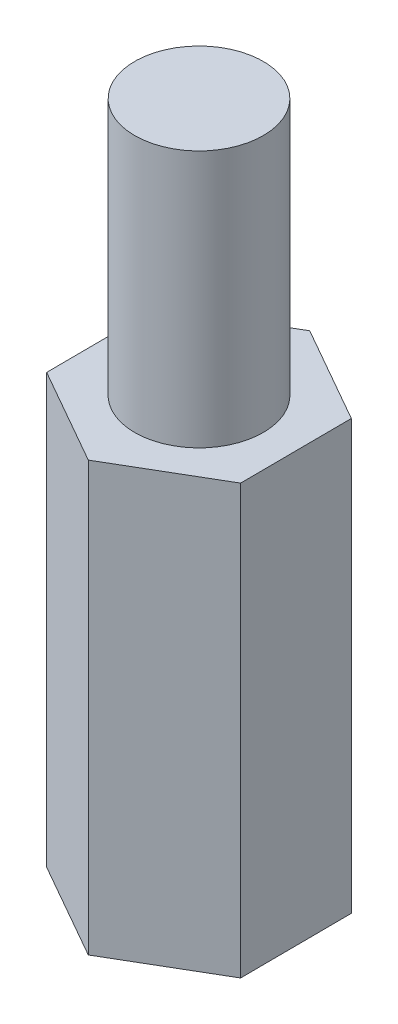
ISO-10303-21;
HEADER;
FILE_DESCRIPTION(('STEP AP214'),'2;1');
FILE_NAME('part.step','',(''),(''),'','','');
FILE_SCHEMA(('AUTOMOTIVE_DESIGN { 1 0 10303 214 1 1 1 1 }'));
ENDSEC;
DATA;
#1=APPLICATION_CONTEXT('core data for automotive mechanical design processes');
#2=APPLICATION_PROTOCOL_DEFINITION('international standard','automotive_design',2000,#1);
#3=PRODUCT_CONTEXT('',#1,'mechanical');
#4=PRODUCT('Part','Part','',(#3));
#5=PRODUCT_RELATED_PRODUCT_CATEGORY('part','',(#4));
#6=PRODUCT_DEFINITION_FORMATION('','',#4);
#7=PRODUCT_DEFINITION_CONTEXT('part definition',#1,'design');
#8=PRODUCT_DEFINITION('design','',#6,#7);
#9=PRODUCT_DEFINITION_SHAPE('','',#8);
#10=(LENGTH_UNIT() NAMED_UNIT(*) SI_UNIT(.MILLI.,.METRE.));
#11=(NAMED_UNIT(*) PLANE_ANGLE_UNIT() SI_UNIT($,.RADIAN.));
#12=(NAMED_UNIT(*) SI_UNIT($,.STERADIAN.) SOLID_ANGLE_UNIT());
#13=UNCERTAINTY_MEASURE_WITH_UNIT(LENGTH_MEASURE(1.E-05),#10,'distance_accuracy_value','');
#14=(GEOMETRIC_REPRESENTATION_CONTEXT(3) GLOBAL_UNCERTAINTY_ASSIGNED_CONTEXT((#13)) GLOBAL_UNIT_ASSIGNED_CONTEXT((#10,
#11,#12)) REPRESENTATION_CONTEXT('',''));
#15=CARTESIAN_POINT('',(0.,0.,0.));
#16=DIRECTION('',(0.,0.,1.));
#17=DIRECTION('',(1.,0.,0.));
#18=AXIS2_PLACEMENT_3D('',#15,#16,#17);
#19=CARTESIAN_POINT('',(0.,10.,0.));
#20=DIRECTION('',(0.,1.,0.));
#21=DIRECTION('',(0.,0.,1.));
#22=AXIS2_PLACEMENT_3D('',#19,#20,#21);
#23=PLANE('',#22);
#24=DIRECTION('',(0.863158425342488,0.,-0.504933196334205));
#25=VECTOR('',#24,1.);
#26=CARTESIAN_POINT('',(0.0148240059962066,10.,2.59803391987985));
#27=LINE('',#26,#25);
#28=CARTESIAN_POINT('',(0.0148240059962066,10.,2.59803391987985));
#29=VERTEX_POINT('',#28);
#30=CARTESIAN_POINT('',(2.25737537750771,10.,1.28617899416135));
#31=VERTEX_POINT('',#30);
#32=EDGE_CURVE('E129',#29,#31,#27,.T.);
#33=ORIENTED_EDGE('',*,*,#32,.T.);
#34=DIRECTION('',(-0.00570576256825319,0.,-0.999983722004271));
#35=VECTOR('',#34,1.);
#36=CARTESIAN_POINT('',(2.25737537750771,10.,1.28617899416135));
#37=LINE('',#36,#35);
#38=CARTESIAN_POINT('',(2.2425513715115,10.,-1.31185492571849));
#39=VERTEX_POINT('',#38);
#40=EDGE_CURVE('E87',#31,#39,#37,.T.);
#41=ORIENTED_EDGE('',*,*,#40,.T.);
#42=DIRECTION('',(-0.868864187910741,0.,-0.495050525670066));
#43=VECTOR('',#42,1.);
#44=CARTESIAN_POINT('',(2.2425513715115,10.,-1.31185492571849));
#45=LINE('',#44,#43);
#46=CARTESIAN_POINT('',(-0.0148240059962053,10.,-2.59803391987984));
#47=VERTEX_POINT('',#46);
#48=EDGE_CURVE('E100',#39,#47,#45,.T.);
#49=ORIENTED_EDGE('',*,*,#48,.T.);
#50=DIRECTION('',(-0.863158425342488,0.,0.504933196334204));
#51=VECTOR('',#50,1.);
#52=CARTESIAN_POINT('',(-0.0148240059962053,10.,-2.59803391987984));
#53=LINE('',#52,#51);
#54=CARTESIAN_POINT('',(-2.25737537750771,10.,-1.28617899416135));
#55=VERTEX_POINT('',#54);
#56=EDGE_CURVE('E94',#47,#55,#53,.T.);
#57=ORIENTED_EDGE('',*,*,#56,.T.);
#58=DIRECTION('',(0.00570576256825252,0.,0.999983722004271));
#59=VECTOR('',#58,1.);
#60=CARTESIAN_POINT('',(-2.25737537750771,10.,-1.28617899416135));
#61=LINE('',#60,#59);
#62=CARTESIAN_POINT('',(-2.24255137151151,10.,1.31185492571849));
#63=VERTEX_POINT('',#62);
#64=EDGE_CURVE('E98',#55,#63,#61,.T.);
#65=ORIENTED_EDGE('',*,*,#64,.T.);
#66=DIRECTION('',(0.868864187910741,0.,0.495050525670066));
#67=VECTOR('',#66,1.);
#68=CARTESIAN_POINT('',(-2.24255137151151,10.,1.31185492571849));
#69=LINE('',#68,#67);
#70=EDGE_CURVE('E50',#63,#29,#69,.T.);
#71=ORIENTED_EDGE('',*,*,#70,.T.);
#72=EDGE_LOOP('',(#33,#41,#49,#57,#65,#71));
#73=FACE_BOUND('',#72,.T.);
#74=CARTESIAN_POINT('',(0.,10.,0.));
#75=DIRECTION('',(0.,1.,0.));
#76=DIRECTION('',(0.,0.,1.));
#77=AXIS2_PLACEMENT_3D('',#74,#75,#76);
#78=CIRCLE('',#77,1.5);
#79=CARTESIAN_POINT('',(0.,10.,1.5));
#80=VERTEX_POINT('',#79);
#81=EDGE_CURVE('E169',#80,#80,#78,.T.);
#82=ORIENTED_EDGE('',*,*,#81,.F.);
#83=EDGE_LOOP('',(#82));
#84=FACE_BOUND('',#83,.T.);
#85=ADVANCED_FACE('F33',(#73,#84),#23,.T.);
#86=CARTESIAN_POINT('',(0.0148240059962066,10.,2.59803391987985));
#87=DIRECTION('',(-0.504933196334205,0.,-0.863158425342488));
#88=DIRECTION('',(-0.863158425342488,0.,0.504933196334205));
#89=AXIS2_PLACEMENT_3D('',#86,#87,#88);
#90=PLANE('',#89);
#91=DIRECTION('',(0.863158425342488,0.,-0.504933196334205));
#92=VECTOR('',#91,1.);
#93=CARTESIAN_POINT('',(0.0148240059962066,0.,2.59803391987985));
#94=LINE('',#93,#92);
#95=CARTESIAN_POINT('',(0.0148240059962066,0.,2.59803391987985));
#96=VERTEX_POINT('',#95);
#97=CARTESIAN_POINT('',(2.25737537750771,0.,1.28617899416135));
#98=VERTEX_POINT('',#97);
#99=EDGE_CURVE('E118',#96,#98,#94,.T.);
#100=ORIENTED_EDGE('',*,*,#99,.T.);
#101=DIRECTION('',(0.,-1.,0.));
#102=VECTOR('',#101,1.);
#103=CARTESIAN_POINT('',(2.25737537750771,10.,1.28617899416135));
#104=LINE('',#103,#102);
#105=EDGE_CURVE('E11',#31,#98,#104,.T.);
#106=ORIENTED_EDGE('',*,*,#105,.F.);
#107=ORIENTED_EDGE('',*,*,#32,.F.);
#108=DIRECTION('',(0.,-1.,0.));
#109=VECTOR('',#108,1.);
#110=CARTESIAN_POINT('',(0.0148240059962066,10.,2.59803391987985));
#111=LINE('',#110,#109);
#112=EDGE_CURVE('E114',#29,#96,#111,.T.);
#113=ORIENTED_EDGE('',*,*,#112,.T.);
#114=EDGE_LOOP('',(#100,#106,#107,#113));
#115=FACE_BOUND('',#114,.T.);
#116=ADVANCED_FACE('F35',(#115),#90,.F.);
#117=CARTESIAN_POINT('',(2.25737537750771,10.,1.28617899416135));
#118=DIRECTION('',(-0.999983722004271,0.,0.00570576256825319));
#119=DIRECTION('',(0.00570576256825319,0.,0.999983722004271));
#120=AXIS2_PLACEMENT_3D('',#117,#118,#119);
#121=PLANE('',#120);
#122=DIRECTION('',(-0.00570576256825319,0.,-0.999983722004271));
#123=VECTOR('',#122,1.);
#124=CARTESIAN_POINT('',(2.25737537750771,0.,1.28617899416135));
#125=LINE('',#124,#123);
#126=CARTESIAN_POINT('',(2.2425513715115,0.,-1.31185492571849));
#127=VERTEX_POINT('',#126);
#128=EDGE_CURVE('E121',#98,#127,#125,.T.);
#129=ORIENTED_EDGE('',*,*,#128,.T.);
#130=DIRECTION('',(0.,-1.,0.));
#131=VECTOR('',#130,1.);
#132=CARTESIAN_POINT('',(2.2425513715115,10.,-1.31185492571849));
#133=LINE('',#132,#131);
#134=EDGE_CURVE('E42',#39,#127,#133,.T.);
#135=ORIENTED_EDGE('',*,*,#134,.F.);
#136=ORIENTED_EDGE('',*,*,#40,.F.);
#137=ORIENTED_EDGE('',*,*,#105,.T.);
#138=EDGE_LOOP('',(#129,#135,#136,#137));
#139=FACE_BOUND('',#138,.T.);
#140=ADVANCED_FACE('F157',(#139),#121,.F.);
#141=CARTESIAN_POINT('',(2.2425513715115,10.,-1.31185492571849));
#142=DIRECTION('',(-0.495050525670066,0.,0.868864187910741));
#143=DIRECTION('',(0.868864187910741,0.,0.495050525670066));
#144=AXIS2_PLACEMENT_3D('',#141,#142,#143);
#145=PLANE('',#144);
#146=DIRECTION('',(-0.868864187910741,0.,-0.495050525670066));
#147=VECTOR('',#146,1.);
#148=CARTESIAN_POINT('',(2.2425513715115,0.,-1.31185492571849));
#149=LINE('',#148,#147);
#150=CARTESIAN_POINT('',(-0.0148240059962053,0.,-2.59803391987984));
#151=VERTEX_POINT('',#150);
#152=EDGE_CURVE('E124',#127,#151,#149,.T.);
#153=ORIENTED_EDGE('',*,*,#152,.T.);
#154=DIRECTION('',(0.,-1.,0.));
#155=VECTOR('',#154,1.);
#156=CARTESIAN_POINT('',(-0.0148240059962053,10.,-2.59803391987984));
#157=LINE('',#156,#155);
#158=EDGE_CURVE('E109',#47,#151,#157,.T.);
#159=ORIENTED_EDGE('',*,*,#158,.F.);
#160=ORIENTED_EDGE('',*,*,#48,.F.);
#161=ORIENTED_EDGE('',*,*,#134,.T.);
#162=EDGE_LOOP('',(#153,#159,#160,#161));
#163=FACE_BOUND('',#162,.T.);
#164=ADVANCED_FACE('F135',(#163),#145,.F.);
#165=CARTESIAN_POINT('',(-0.0148240059962053,10.,-2.59803391987984));
#166=DIRECTION('',(0.504933196334204,0.,0.863158425342488));
#167=DIRECTION('',(0.863158425342488,0.,-0.504933196334204));
#168=AXIS2_PLACEMENT_3D('',#165,#166,#167);
#169=PLANE('',#168);
#170=DIRECTION('',(-0.863158425342488,0.,0.504933196334204));
#171=VECTOR('',#170,1.);
#172=CARTESIAN_POINT('',(-0.0148240059962053,0.,-2.59803391987984));
#173=LINE('',#172,#171);
#174=CARTESIAN_POINT('',(-2.25737537750771,0.,-1.28617899416135));
#175=VERTEX_POINT('',#174);
#176=EDGE_CURVE('E108',#151,#175,#173,.T.);
#177=ORIENTED_EDGE('',*,*,#176,.T.);
#178=DIRECTION('',(0.,-1.,0.));
#179=VECTOR('',#178,1.);
#180=CARTESIAN_POINT('',(-2.25737537750771,10.,-1.28617899416135));
#181=LINE('',#180,#179);
#182=EDGE_CURVE('E105',#55,#175,#181,.T.);
#183=ORIENTED_EDGE('',*,*,#182,.F.);
#184=ORIENTED_EDGE('',*,*,#56,.F.);
#185=ORIENTED_EDGE('',*,*,#158,.T.);
#186=EDGE_LOOP('',(#177,#183,#184,#185));
#187=FACE_BOUND('',#186,.T.);
#188=ADVANCED_FACE('F106',(#187),#169,.F.);
#189=CARTESIAN_POINT('',(-2.25737537750771,10.,-1.28617899416135));
#190=DIRECTION('',(0.999983722004271,0.,-0.00570576256825252));
#191=DIRECTION('',(-0.00570576256825252,0.,-0.999983722004271));
#192=AXIS2_PLACEMENT_3D('',#189,#190,#191);
#193=PLANE('',#192);
#194=DIRECTION('',(0.00570576256825252,0.,0.999983722004271));
#195=VECTOR('',#194,1.);
#196=CARTESIAN_POINT('',(-2.25737537750771,0.,-1.28617899416135));
#197=LINE('',#196,#195);
#198=CARTESIAN_POINT('',(-2.24255137151151,0.,1.31185492571849));
#199=VERTEX_POINT('',#198);
#200=EDGE_CURVE('E73',#175,#199,#197,.T.);
#201=ORIENTED_EDGE('',*,*,#200,.T.);
#202=DIRECTION('',(0.,-1.,0.));
#203=VECTOR('',#202,1.);
#204=CARTESIAN_POINT('',(-2.24255137151151,10.,1.31185492571849));
#205=LINE('',#204,#203);
#206=EDGE_CURVE('E110',#63,#199,#205,.T.);
#207=ORIENTED_EDGE('',*,*,#206,.F.);
#208=ORIENTED_EDGE('',*,*,#64,.F.);
#209=ORIENTED_EDGE('',*,*,#182,.T.);
#210=EDGE_LOOP('',(#201,#207,#208,#209));
#211=FACE_BOUND('',#210,.T.);
#212=ADVANCED_FACE('F112',(#211),#193,.F.);
#213=CARTESIAN_POINT('',(-2.24255137151151,10.,1.31185492571849));
#214=DIRECTION('',(0.495050525670066,0.,-0.868864187910741));
#215=DIRECTION('',(-0.868864187910741,0.,-0.495050525670066));
#216=AXIS2_PLACEMENT_3D('',#213,#214,#215);
#217=PLANE('',#216);
#218=DIRECTION('',(0.868864187910741,0.,0.495050525670066));
#219=VECTOR('',#218,1.);
#220=CARTESIAN_POINT('',(-2.24255137151151,0.,1.31185492571849));
#221=LINE('',#220,#219);
#222=EDGE_CURVE('E79',#199,#96,#221,.T.);
#223=ORIENTED_EDGE('',*,*,#222,.T.);
#224=ORIENTED_EDGE('',*,*,#112,.F.);
#225=ORIENTED_EDGE('',*,*,#70,.F.);
#226=ORIENTED_EDGE('',*,*,#206,.T.);
#227=EDGE_LOOP('',(#223,#224,#225,#226));
#228=FACE_BOUND('',#227,.T.);
#229=ADVANCED_FACE('F142',(#228),#217,.F.);
#230=CARTESIAN_POINT('',(0.,0.,0.));
#231=DIRECTION('',(0.,1.,0.));
#232=DIRECTION('',(0.,0.,1.));
#233=AXIS2_PLACEMENT_3D('',#230,#231,#232);
#234=PLANE('',#233);
#235=ORIENTED_EDGE('',*,*,#99,.F.);
#236=ORIENTED_EDGE('',*,*,#222,.F.);
#237=ORIENTED_EDGE('',*,*,#200,.F.);
#238=ORIENTED_EDGE('',*,*,#176,.F.);
#239=ORIENTED_EDGE('',*,*,#152,.F.);
#240=ORIENTED_EDGE('',*,*,#128,.F.);
#241=EDGE_LOOP('',(#235,#236,#237,#238,#239,#240));
#242=FACE_BOUND('',#241,.T.);
#243=ADVANCED_FACE('F138',(#242),#234,.F.);
#244=CARTESIAN_POINT('',(0.,16.,0.));
#245=DIRECTION('',(0.,-1.,0.));
#246=DIRECTION('',(0.,0.,-1.));
#247=AXIS2_PLACEMENT_3D('',#244,#245,#246);
#248=CYLINDRICAL_SURFACE('',#247,1.5);
#249=CARTESIAN_POINT('',(0.,16.,0.));
#250=DIRECTION('',(0.,1.,0.));
#251=DIRECTION('',(0.,0.,1.));
#252=AXIS2_PLACEMENT_3D('',#249,#250,#251);
#253=CIRCLE('',#252,1.5);
#254=CARTESIAN_POINT('',(0.,16.,1.5));
#255=VERTEX_POINT('',#254);
#256=EDGE_CURVE('E122',#255,#255,#253,.T.);
#257=ORIENTED_EDGE('',*,*,#256,.F.);
#258=EDGE_LOOP('',(#257));
#259=FACE_BOUND('',#258,.T.);
#260=ORIENTED_EDGE('',*,*,#81,.T.);
#261=EDGE_LOOP('',(#260));
#262=FACE_BOUND('',#261,.T.);
#263=ADVANCED_FACE('F149',(#259,#262),#248,.T.);
#264=CARTESIAN_POINT('',(0.,16.,0.));
#265=DIRECTION('',(0.,1.,0.));
#266=DIRECTION('',(0.,0.,1.));
#267=AXIS2_PLACEMENT_3D('',#264,#265,#266);
#268=PLANE('',#267);
#269=ORIENTED_EDGE('',*,*,#256,.T.);
#270=EDGE_LOOP('',(#269));
#271=FACE_BOUND('',#270,.T.);
#272=ADVANCED_FACE('F161',(#271),#268,.T.);
#273=CLOSED_SHELL('',(#85,#116,#140,#164,#188,#212,#229,#243,#263,#272));
#274=MANIFOLD_SOLID_BREP('B2',#273);
#275=ADVANCED_BREP_SHAPE_REPRESENTATION('',(#18,#274),#14);
#276=SHAPE_DEFINITION_REPRESENTATION(#9,#275);
ENDSEC;
END-ISO-10303-21;
